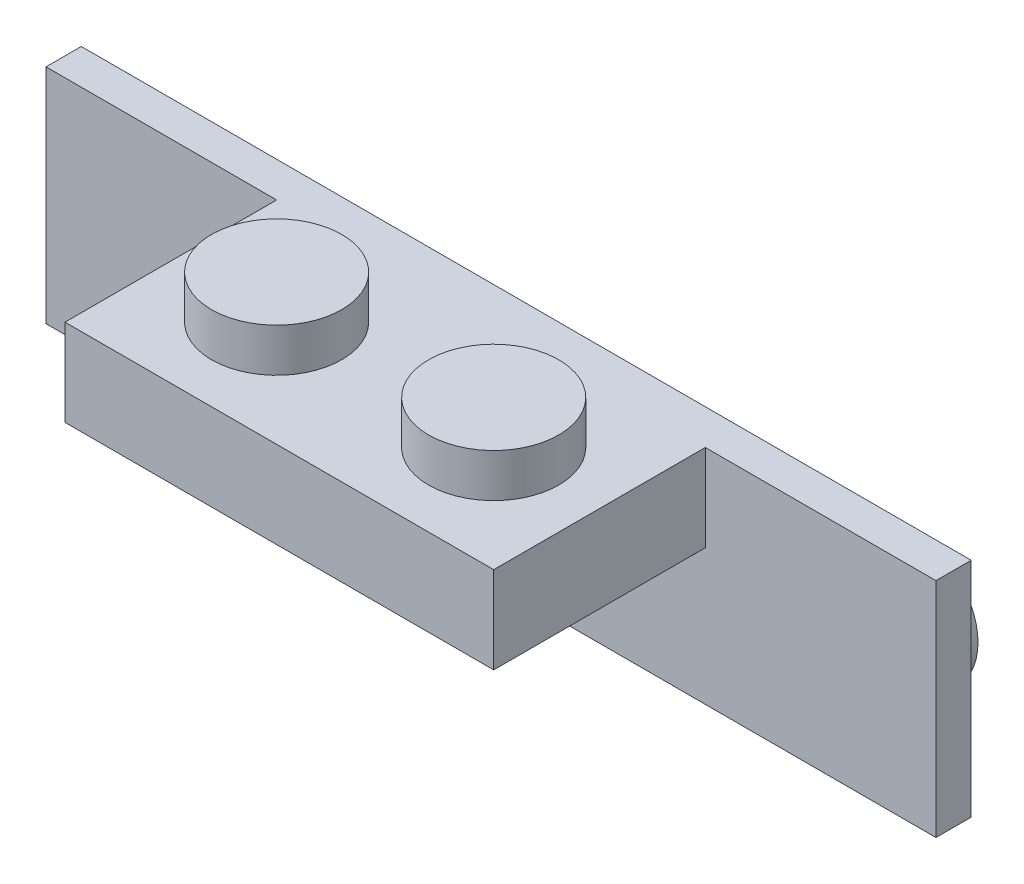
ISO-10303-21;
HEADER;
FILE_DESCRIPTION(('STEP AP214'),'2;1');
FILE_NAME('part.step','',(''),(''),'','','');
FILE_SCHEMA(('AUTOMOTIVE_DESIGN { 1 0 10303 214 1 1 1 1 }'));
ENDSEC;
DATA;
#1=APPLICATION_CONTEXT('core data for automotive mechanical design processes');
#2=APPLICATION_PROTOCOL_DEFINITION('international standard','automotive_design',2000,#1);
#3=PRODUCT_CONTEXT('',#1,'mechanical');
#4=PRODUCT('Part','Part','',(#3));
#5=PRODUCT_RELATED_PRODUCT_CATEGORY('part','',(#4));
#6=PRODUCT_DEFINITION_FORMATION('','',#4);
#7=PRODUCT_DEFINITION_CONTEXT('part definition',#1,'design');
#8=PRODUCT_DEFINITION('design','',#6,#7);
#9=PRODUCT_DEFINITION_SHAPE('','',#8);
#10=(LENGTH_UNIT() NAMED_UNIT(*) SI_UNIT(.MILLI.,.METRE.));
#11=(NAMED_UNIT(*) PLANE_ANGLE_UNIT() SI_UNIT($,.RADIAN.));
#12=(NAMED_UNIT(*) SI_UNIT($,.STERADIAN.) SOLID_ANGLE_UNIT());
#13=UNCERTAINTY_MEASURE_WITH_UNIT(LENGTH_MEASURE(1.E-05),#10,'distance_accuracy_value','');
#14=(GEOMETRIC_REPRESENTATION_CONTEXT(3) GLOBAL_UNCERTAINTY_ASSIGNED_CONTEXT((#13)) GLOBAL_UNIT_ASSIGNED_CONTEXT((#10,
#11,#12)) REPRESENTATION_CONTEXT('',''));
#15=CARTESIAN_POINT('',(0.,0.,0.));
#16=DIRECTION('',(0.,0.,1.));
#17=DIRECTION('',(1.,0.,0.));
#18=AXIS2_PLACEMENT_3D('',#15,#16,#17);
#19=CARTESIAN_POINT('',(0.,0.,-7.8));
#20=DIRECTION('',(0.,-1.,0.));
#21=DIRECTION('',(0.,0.,-1.));
#22=AXIS2_PLACEMENT_3D('',#19,#20,#21);
#23=PLANE('',#22);
#24=DIRECTION('',(1.,0.,0.));
#25=VECTOR('',#24,1.);
#26=CARTESIAN_POINT('',(0.,0.,0.));
#27=LINE('',#26,#25);
#28=CARTESIAN_POINT('',(0.,0.,0.));
#29=VERTEX_POINT('',#28);
#30=CARTESIAN_POINT('',(15.8,0.,0.));
#31=VERTEX_POINT('',#30);
#32=EDGE_CURVE('E106',#29,#31,#27,.T.);
#33=ORIENTED_EDGE('',*,*,#32,.F.);
#34=DIRECTION('',(0.,0.,1.));
#35=VECTOR('',#34,1.);
#36=CARTESIAN_POINT('',(0.,0.,-7.8));
#37=LINE('',#36,#35);
#38=CARTESIAN_POINT('',(0.,0.,-7.8));
#39=VERTEX_POINT('',#38);
#40=EDGE_CURVE('E127',#39,#29,#37,.T.);
#41=ORIENTED_EDGE('',*,*,#40,.F.);
#42=DIRECTION('',(1.,0.,0.));
#43=VECTOR('',#42,1.);
#44=CARTESIAN_POINT('',(0.,0.,-7.8));
#45=LINE('',#44,#43);
#46=CARTESIAN_POINT('',(15.8,0.,-7.8));
#47=VERTEX_POINT('',#46);
#48=EDGE_CURVE('E118',#39,#47,#45,.T.);
#49=ORIENTED_EDGE('',*,*,#48,.T.);
#50=DIRECTION('',(0.,0.,1.));
#51=VECTOR('',#50,1.);
#52=CARTESIAN_POINT('',(15.8,0.,-7.8));
#53=LINE('',#52,#51);
#54=EDGE_CURVE('E98',#47,#31,#53,.T.);
#55=ORIENTED_EDGE('',*,*,#54,.T.);
#56=EDGE_LOOP('',(#33,#41,#49,#55));
#57=FACE_BOUND('',#56,.T.);
#58=DIRECTION('',(0.,0.,1.));
#59=VECTOR('',#58,1.);
#60=CARTESIAN_POINT('',(1.2,0.,-7.8));
#61=LINE('',#60,#59);
#62=CARTESIAN_POINT('',(1.2,0.,-6.6));
#63=VERTEX_POINT('',#62);
#64=CARTESIAN_POINT('',(1.2,0.,-1.2));
#65=VERTEX_POINT('',#64);
#66=EDGE_CURVE('E249',#63,#65,#61,.T.);
#67=ORIENTED_EDGE('',*,*,#66,.T.);
#68=DIRECTION('',(1.,0.,0.));
#69=VECTOR('',#68,1.);
#70=CARTESIAN_POINT('',(0.,0.,-1.2));
#71=LINE('',#70,#69);
#72=CARTESIAN_POINT('',(14.6,0.,-1.2));
#73=VERTEX_POINT('',#72);
#74=EDGE_CURVE('E217',#65,#73,#71,.T.);
#75=ORIENTED_EDGE('',*,*,#74,.T.);
#76=DIRECTION('',(0.,0.,1.));
#77=VECTOR('',#76,1.);
#78=CARTESIAN_POINT('',(14.6,0.,-7.8));
#79=LINE('',#78,#77);
#80=CARTESIAN_POINT('',(14.6,0.,-6.6));
#81=VERTEX_POINT('',#80);
#82=EDGE_CURVE('E244',#81,#73,#79,.T.);
#83=ORIENTED_EDGE('',*,*,#82,.F.);
#84=DIRECTION('',(1.,0.,0.));
#85=VECTOR('',#84,1.);
#86=CARTESIAN_POINT('',(0.,0.,-6.6));
#87=LINE('',#86,#85);
#88=EDGE_CURVE('E59',#63,#81,#87,.T.);
#89=ORIENTED_EDGE('',*,*,#88,.F.);
#90=EDGE_LOOP('',(#67,#75,#83,#89));
#91=FACE_BOUND('',#90,.T.);
#92=ADVANCED_FACE('F43',(#57,#91),#23,.T.);
#93=CARTESIAN_POINT('',(0.,0.,-7.8));
#94=DIRECTION('',(-1.,0.,0.));
#95=DIRECTION('',(0.,0.,1.));
#96=AXIS2_PLACEMENT_3D('',#93,#94,#95);
#97=PLANE('',#96);
#98=DIRECTION('',(0.,-1.,0.));
#99=VECTOR('',#98,1.);
#100=CARTESIAN_POINT('',(0.,0.,0.));
#101=LINE('',#100,#99);
#102=CARTESIAN_POINT('',(0.,3.2,0.));
#103=VERTEX_POINT('',#102);
#104=EDGE_CURVE('E285',#103,#29,#101,.T.);
#105=ORIENTED_EDGE('',*,*,#104,.F.);
#106=DIRECTION('',(0.,0.,1.));
#107=VECTOR('',#106,1.);
#108=CARTESIAN_POINT('',(0.,3.2,-7.8));
#109=LINE('',#108,#107);
#110=CARTESIAN_POINT('',(0.,3.2,-7.8));
#111=VERTEX_POINT('',#110);
#112=EDGE_CURVE('E97',#111,#103,#109,.T.);
#113=ORIENTED_EDGE('',*,*,#112,.F.);
#114=DIRECTION('',(0.,-1.,0.));
#115=VECTOR('',#114,1.);
#116=CARTESIAN_POINT('',(0.,0.,-7.8));
#117=LINE('',#116,#115);
#118=EDGE_CURVE('E114',#111,#39,#117,.T.);
#119=ORIENTED_EDGE('',*,*,#118,.T.);
#120=ORIENTED_EDGE('',*,*,#40,.T.);
#121=EDGE_LOOP('',(#105,#113,#119,#120));
#122=FACE_BOUND('',#121,.T.);
#123=ADVANCED_FACE('F45',(#122),#97,.T.);
#124=CARTESIAN_POINT('',(0.,3.2,-7.8));
#125=DIRECTION('',(0.,1.,0.));
#126=DIRECTION('',(0.,0.,1.));
#127=AXIS2_PLACEMENT_3D('',#124,#125,#126);
#128=PLANE('',#127);
#129=CARTESIAN_POINT('',(11.9,3.2,-3.9));
#130=DIRECTION('',(0.,1.,0.));
#131=DIRECTION('',(0.,0.,1.));
#132=AXIS2_PLACEMENT_3D('',#129,#130,#131);
#133=CIRCLE('',#132,2.4);
#134=CARTESIAN_POINT('',(11.9,3.2,-1.5));
#135=VERTEX_POINT('',#134);
#136=EDGE_CURVE('E223',#135,#135,#133,.T.);
#137=ORIENTED_EDGE('',*,*,#136,.F.);
#138=EDGE_LOOP('',(#137));
#139=FACE_BOUND('',#138,.T.);
#140=CARTESIAN_POINT('',(3.9,3.2,-3.9));
#141=DIRECTION('',(0.,1.,0.));
#142=DIRECTION('',(0.,0.,1.));
#143=AXIS2_PLACEMENT_3D('',#140,#141,#142);
#144=CIRCLE('',#143,2.4);
#145=CARTESIAN_POINT('',(3.9,3.2,-1.5));
#146=VERTEX_POINT('',#145);
#147=EDGE_CURVE('E280',#146,#146,#144,.T.);
#148=ORIENTED_EDGE('',*,*,#147,.F.);
#149=EDGE_LOOP('',(#148));
#150=FACE_BOUND('',#149,.T.);
#151=DIRECTION('',(-1.,0.,0.));
#152=VECTOR('',#151,1.);
#153=CARTESIAN_POINT('',(0.,3.2,0.));
#154=LINE('',#153,#152);
#155=CARTESIAN_POINT('',(15.8,3.2,0.));
#156=VERTEX_POINT('',#155);
#157=EDGE_CURVE('E104',#156,#103,#154,.T.);
#158=ORIENTED_EDGE('',*,*,#157,.F.);
#159=DIRECTION('',(0.,0.,1.));
#160=VECTOR('',#159,1.);
#161=CARTESIAN_POINT('',(15.8,3.2,-7.8));
#162=LINE('',#161,#160);
#163=CARTESIAN_POINT('',(15.8,3.19999999999999,-7.8));
#164=VERTEX_POINT('',#163);
#165=EDGE_CURVE('E87',#164,#156,#162,.T.);
#166=ORIENTED_EDGE('',*,*,#165,.F.);
#167=DIRECTION('',(1.,0.,0.));
#168=VECTOR('',#167,1.);
#169=CARTESIAN_POINT('',(24.3,3.19999999999999,-7.8));
#170=LINE('',#169,#168);
#171=CARTESIAN_POINT('',(24.3,3.19999999999999,-7.8));
#172=VERTEX_POINT('',#171);
#173=EDGE_CURVE('E805',#164,#172,#170,.T.);
#174=ORIENTED_EDGE('',*,*,#173,.T.);
#175=DIRECTION('',(0.,0.,1.));
#176=VECTOR('',#175,1.);
#177=CARTESIAN_POINT('',(24.3,3.19999999999999,-9.1));
#178=LINE('',#177,#176);
#179=CARTESIAN_POINT('',(24.3,3.19999999999999,-9.1));
#180=VERTEX_POINT('',#179);
#181=EDGE_CURVE('E795',#180,#172,#178,.T.);
#182=ORIENTED_EDGE('',*,*,#181,.F.);
#183=DIRECTION('',(1.,0.,0.));
#184=VECTOR('',#183,1.);
#185=CARTESIAN_POINT('',(24.3,3.19999999999999,-9.1));
#186=LINE('',#185,#184);
#187=CARTESIAN_POINT('',(-8.5,3.2,-9.1));
#188=VERTEX_POINT('',#187);
#189=EDGE_CURVE('E173',#188,#180,#186,.T.);
#190=ORIENTED_EDGE('',*,*,#189,.F.);
#191=DIRECTION('',(0.,0.,1.));
#192=VECTOR('',#191,1.);
#193=CARTESIAN_POINT('',(-8.5,3.2,-9.1));
#194=LINE('',#193,#192);
#195=CARTESIAN_POINT('',(-8.5,3.2,-7.8));
#196=VERTEX_POINT('',#195);
#197=EDGE_CURVE('E201',#188,#196,#194,.T.);
#198=ORIENTED_EDGE('',*,*,#197,.T.);
#199=EDGE_CURVE('E180',#196,#111,#170,.T.);
#200=ORIENTED_EDGE('',*,*,#199,.T.);
#201=ORIENTED_EDGE('',*,*,#112,.T.);
#202=EDGE_LOOP('',(#158,#166,#174,#182,#190,#198,#200,#201));
#203=FACE_BOUND('',#202,.T.);
#204=ADVANCED_FACE('F109',(#139,#150,#203),#128,.T.);
#205=CARTESIAN_POINT('',(15.8,0.,-7.8));
#206=DIRECTION('',(1.,0.,0.));
#207=DIRECTION('',(0.,0.,-1.));
#208=AXIS2_PLACEMENT_3D('',#205,#206,#207);
#209=PLANE('',#208);
#210=DIRECTION('',(0.,1.,0.));
#211=VECTOR('',#210,1.);
#212=CARTESIAN_POINT('',(15.8,0.,0.));
#213=LINE('',#212,#211);
#214=EDGE_CURVE('E90',#31,#156,#213,.T.);
#215=ORIENTED_EDGE('',*,*,#214,.F.);
#216=ORIENTED_EDGE('',*,*,#54,.F.);
#217=DIRECTION('',(0.,1.,0.));
#218=VECTOR('',#217,1.);
#219=CARTESIAN_POINT('',(15.8,0.,-7.8));
#220=LINE('',#219,#218);
#221=EDGE_CURVE('E68',#47,#164,#220,.T.);
#222=ORIENTED_EDGE('',*,*,#221,.T.);
#223=ORIENTED_EDGE('',*,*,#165,.T.);
#224=EDGE_LOOP('',(#215,#216,#222,#223));
#225=FACE_BOUND('',#224,.T.);
#226=ADVANCED_FACE('F89',(#225),#209,.T.);
#227=CARTESIAN_POINT('',(0.,0.,0.));
#228=DIRECTION('',(0.,0.,-1.));
#229=DIRECTION('',(-1.,0.,0.));
#230=AXIS2_PLACEMENT_3D('',#227,#228,#229);
#231=PLANE('',#230);
#232=ORIENTED_EDGE('',*,*,#104,.T.);
#233=ORIENTED_EDGE('',*,*,#32,.T.);
#234=ORIENTED_EDGE('',*,*,#214,.T.);
#235=ORIENTED_EDGE('',*,*,#157,.T.);
#236=EDGE_LOOP('',(#232,#233,#234,#235));
#237=FACE_BOUND('',#236,.T.);
#238=ADVANCED_FACE('F103',(#237),#231,.F.);
#239=CARTESIAN_POINT('',(3.9,4.8,-3.9));
#240=DIRECTION('',(0.,-1.,0.));
#241=DIRECTION('',(0.,0.,-1.));
#242=AXIS2_PLACEMENT_3D('',#239,#240,#241);
#243=CYLINDRICAL_SURFACE('',#242,2.4);
#244=CARTESIAN_POINT('',(3.9,4.8,-3.9));
#245=DIRECTION('',(0.,1.,0.));
#246=DIRECTION('',(0.,0.,1.));
#247=AXIS2_PLACEMENT_3D('',#244,#245,#246);
#248=CIRCLE('',#247,2.4);
#249=CARTESIAN_POINT('',(3.9,4.8,-1.5));
#250=VERTEX_POINT('',#249);
#251=EDGE_CURVE('E281',#250,#250,#248,.T.);
#252=ORIENTED_EDGE('',*,*,#251,.F.);
#253=EDGE_LOOP('',(#252));
#254=FACE_BOUND('',#253,.T.);
#255=ORIENTED_EDGE('',*,*,#147,.T.);
#256=EDGE_LOOP('',(#255));
#257=FACE_BOUND('',#256,.T.);
#258=ADVANCED_FACE('F366',(#254,#257),#243,.T.);
#259=CARTESIAN_POINT('',(3.9,4.8,-3.9));
#260=DIRECTION('',(0.,1.,0.));
#261=DIRECTION('',(0.,0.,1.));
#262=AXIS2_PLACEMENT_3D('',#259,#260,#261);
#263=PLANE('',#262);
#264=ORIENTED_EDGE('',*,*,#251,.T.);
#265=EDGE_LOOP('',(#264));
#266=FACE_BOUND('',#265,.T.);
#267=ADVANCED_FACE('F369',(#266),#263,.T.);
#268=CARTESIAN_POINT('',(11.9,4.8,-3.9));
#269=DIRECTION('',(0.,-1.,0.));
#270=DIRECTION('',(0.,0.,-1.));
#271=AXIS2_PLACEMENT_3D('',#268,#269,#270);
#272=CYLINDRICAL_SURFACE('',#271,2.4);
#273=CARTESIAN_POINT('',(11.9,4.8,-3.9));
#274=DIRECTION('',(0.,1.,0.));
#275=DIRECTION('',(0.,0.,1.));
#276=AXIS2_PLACEMENT_3D('',#273,#274,#275);
#277=CIRCLE('',#276,2.4);
#278=CARTESIAN_POINT('',(11.9,4.8,-1.5));
#279=VERTEX_POINT('',#278);
#280=EDGE_CURVE('E276',#279,#279,#277,.T.);
#281=ORIENTED_EDGE('',*,*,#280,.F.);
#282=EDGE_LOOP('',(#281));
#283=FACE_BOUND('',#282,.T.);
#284=ORIENTED_EDGE('',*,*,#136,.T.);
#285=EDGE_LOOP('',(#284));
#286=FACE_BOUND('',#285,.T.);
#287=ADVANCED_FACE('F373',(#283,#286),#272,.T.);
#288=CARTESIAN_POINT('',(11.9,4.8,-3.9));
#289=DIRECTION('',(0.,1.,0.));
#290=DIRECTION('',(0.,0.,1.));
#291=AXIS2_PLACEMENT_3D('',#288,#289,#290);
#292=PLANE('',#291);
#293=ORIENTED_EDGE('',*,*,#280,.T.);
#294=EDGE_LOOP('',(#293));
#295=FACE_BOUND('',#294,.T.);
#296=ADVANCED_FACE('F346',(#295),#292,.T.);
#297=CARTESIAN_POINT('',(1.2,0.,-7.8));
#298=DIRECTION('',(-1.,0.,0.));
#299=DIRECTION('',(0.,0.,1.));
#300=AXIS2_PLACEMENT_3D('',#297,#298,#299);
#301=PLANE('',#300);
#302=DIRECTION('',(0.,-1.,0.));
#303=VECTOR('',#302,1.);
#304=CARTESIAN_POINT('',(1.2,0.,-1.2));
#305=LINE('',#304,#303);
#306=CARTESIAN_POINT('',(1.2,2.,-1.2));
#307=VERTEX_POINT('',#306);
#308=EDGE_CURVE('E213',#307,#65,#305,.T.);
#309=ORIENTED_EDGE('',*,*,#308,.T.);
#310=ORIENTED_EDGE('',*,*,#66,.F.);
#311=DIRECTION('',(0.,-1.,0.));
#312=VECTOR('',#311,1.);
#313=CARTESIAN_POINT('',(1.2,0.,-6.6));
#314=LINE('',#313,#312);
#315=CARTESIAN_POINT('',(1.2,2.,-6.6));
#316=VERTEX_POINT('',#315);
#317=EDGE_CURVE('E225',#316,#63,#314,.T.);
#318=ORIENTED_EDGE('',*,*,#317,.F.);
#319=DIRECTION('',(0.,0.,1.));
#320=VECTOR('',#319,1.);
#321=CARTESIAN_POINT('',(1.2,2.,-7.8));
#322=LINE('',#321,#320);
#323=EDGE_CURVE('E219',#316,#307,#322,.T.);
#324=ORIENTED_EDGE('',*,*,#323,.T.);
#325=EDGE_LOOP('',(#309,#310,#318,#324));
#326=FACE_BOUND('',#325,.T.);
#327=ADVANCED_FACE('F332',(#326),#301,.F.);
#328=CARTESIAN_POINT('',(0.,2.,-7.8));
#329=DIRECTION('',(0.,1.,0.));
#330=DIRECTION('',(0.,0.,1.));
#331=AXIS2_PLACEMENT_3D('',#328,#329,#330);
#332=PLANE('',#331);
#333=CARTESIAN_POINT('',(7.9,2.,-3.9));
#334=DIRECTION('',(0.,1.,0.));
#335=DIRECTION('',(0.,0.,1.));
#336=AXIS2_PLACEMENT_3D('',#333,#334,#335);
#337=CIRCLE('',#336,1.5);
#338=CARTESIAN_POINT('',(7.9,2.,-2.4));
#339=VERTEX_POINT('',#338);
#340=EDGE_CURVE('E123',#339,#339,#337,.F.);
#341=ORIENTED_EDGE('',*,*,#340,.F.);
#342=EDGE_LOOP('',(#341));
#343=FACE_BOUND('',#342,.T.);
#344=CARTESIAN_POINT('',(11.9,2.,-3.9));
#345=DIRECTION('',(0.,1.,0.));
#346=DIRECTION('',(0.,0.,1.));
#347=AXIS2_PLACEMENT_3D('',#344,#345,#346);
#348=CIRCLE('',#347,1.2);
#349=CARTESIAN_POINT('',(11.9,2.,-2.7));
#350=VERTEX_POINT('',#349);
#351=EDGE_CURVE('E209',#350,#350,#348,.T.);
#352=ORIENTED_EDGE('',*,*,#351,.T.);
#353=EDGE_LOOP('',(#352));
#354=FACE_BOUND('',#353,.T.);
#355=CARTESIAN_POINT('',(3.9,2.,-3.9));
#356=DIRECTION('',(0.,1.,0.));
#357=DIRECTION('',(0.,0.,1.));
#358=AXIS2_PLACEMENT_3D('',#355,#356,#357);
#359=CIRCLE('',#358,1.2);
#360=CARTESIAN_POINT('',(3.9,2.,-2.7));
#361=VERTEX_POINT('',#360);
#362=EDGE_CURVE('E233',#361,#361,#359,.T.);
#363=ORIENTED_EDGE('',*,*,#362,.T.);
#364=EDGE_LOOP('',(#363));
#365=FACE_BOUND('',#364,.T.);
#366=DIRECTION('',(-1.,0.,0.));
#367=VECTOR('',#366,1.);
#368=CARTESIAN_POINT('',(0.,2.,-1.2));
#369=LINE('',#368,#367);
#370=CARTESIAN_POINT('',(14.6,2.,-1.2));
#371=VERTEX_POINT('',#370);
#372=EDGE_CURVE('E228',#371,#307,#369,.T.);
#373=ORIENTED_EDGE('',*,*,#372,.T.);
#374=ORIENTED_EDGE('',*,*,#323,.F.);
#375=DIRECTION('',(-1.,0.,0.));
#376=VECTOR('',#375,1.);
#377=CARTESIAN_POINT('',(0.,2.,-6.6));
#378=LINE('',#377,#376);
#379=CARTESIAN_POINT('',(14.6,2.,-6.6));
#380=VERTEX_POINT('',#379);
#381=EDGE_CURVE('E245',#380,#316,#378,.T.);
#382=ORIENTED_EDGE('',*,*,#381,.F.);
#383=DIRECTION('',(0.,0.,1.));
#384=VECTOR('',#383,1.);
#385=CARTESIAN_POINT('',(14.6,2.,-7.8));
#386=LINE('',#385,#384);
#387=EDGE_CURVE('E224',#380,#371,#386,.T.);
#388=ORIENTED_EDGE('',*,*,#387,.T.);
#389=EDGE_LOOP('',(#373,#374,#382,#388));
#390=FACE_BOUND('',#389,.T.);
#391=ADVANCED_FACE('F336',(#343,#354,#365,#390),#332,.F.);
#392=CARTESIAN_POINT('',(14.6,0.,-7.8));
#393=DIRECTION('',(1.,0.,0.));
#394=DIRECTION('',(0.,0.,-1.));
#395=AXIS2_PLACEMENT_3D('',#392,#393,#394);
#396=PLANE('',#395);
#397=DIRECTION('',(0.,1.,0.));
#398=VECTOR('',#397,1.);
#399=CARTESIAN_POINT('',(14.6,0.,-1.2));
#400=LINE('',#399,#398);
#401=EDGE_CURVE('E240',#73,#371,#400,.T.);
#402=ORIENTED_EDGE('',*,*,#401,.T.);
#403=ORIENTED_EDGE('',*,*,#387,.F.);
#404=DIRECTION('',(0.,1.,0.));
#405=VECTOR('',#404,1.);
#406=CARTESIAN_POINT('',(14.6,0.,-6.6));
#407=LINE('',#406,#405);
#408=EDGE_CURVE('E250',#81,#380,#407,.T.);
#409=ORIENTED_EDGE('',*,*,#408,.F.);
#410=ORIENTED_EDGE('',*,*,#82,.T.);
#411=EDGE_LOOP('',(#402,#403,#409,#410));
#412=FACE_BOUND('',#411,.T.);
#413=ADVANCED_FACE('F325',(#412),#396,.F.);
#414=CARTESIAN_POINT('',(0.,0.,-6.6));
#415=DIRECTION('',(0.,0.,-1.));
#416=DIRECTION('',(-1.,0.,0.));
#417=AXIS2_PLACEMENT_3D('',#414,#415,#416);
#418=PLANE('',#417);
#419=ORIENTED_EDGE('',*,*,#317,.T.);
#420=ORIENTED_EDGE('',*,*,#88,.T.);
#421=ORIENTED_EDGE('',*,*,#408,.T.);
#422=ORIENTED_EDGE('',*,*,#381,.T.);
#423=EDGE_LOOP('',(#419,#420,#421,#422));
#424=FACE_BOUND('',#423,.T.);
#425=ADVANCED_FACE('F333',(#424),#418,.F.);
#426=CARTESIAN_POINT('',(0.,0.,-1.2));
#427=DIRECTION('',(0.,0.,-1.));
#428=DIRECTION('',(-1.,0.,0.));
#429=AXIS2_PLACEMENT_3D('',#426,#427,#428);
#430=PLANE('',#429);
#431=ORIENTED_EDGE('',*,*,#308,.F.);
#432=ORIENTED_EDGE('',*,*,#372,.F.);
#433=ORIENTED_EDGE('',*,*,#401,.F.);
#434=ORIENTED_EDGE('',*,*,#74,.F.);
#435=EDGE_LOOP('',(#431,#432,#433,#434));
#436=FACE_BOUND('',#435,.T.);
#437=ADVANCED_FACE('F329',(#436),#430,.T.);
#438=CARTESIAN_POINT('',(3.9,4.8,-3.9));
#439=DIRECTION('',(0.,-1.,0.));
#440=DIRECTION('',(0.,0.,-1.));
#441=AXIS2_PLACEMENT_3D('',#438,#439,#440);
#442=CYLINDRICAL_SURFACE('',#441,1.2);
#443=CARTESIAN_POINT('',(3.9,3.6,-3.9));
#444=DIRECTION('',(0.,1.,0.));
#445=DIRECTION('',(0.,0.,1.));
#446=AXIS2_PLACEMENT_3D('',#443,#444,#445);
#447=CIRCLE('',#446,1.2);
#448=CARTESIAN_POINT('',(3.9,3.6,-2.7));
#449=VERTEX_POINT('',#448);
#450=EDGE_CURVE('E218',#449,#449,#447,.T.);
#451=ORIENTED_EDGE('',*,*,#450,.T.);
#452=EDGE_LOOP('',(#451));
#453=FACE_BOUND('',#452,.T.);
#454=ORIENTED_EDGE('',*,*,#362,.F.);
#455=EDGE_LOOP('',(#454));
#456=FACE_BOUND('',#455,.T.);
#457=ADVANCED_FACE('F393',(#453,#456),#442,.F.);
#458=CARTESIAN_POINT('',(3.9,3.6,-3.9));
#459=DIRECTION('',(0.,1.,0.));
#460=DIRECTION('',(0.,0.,1.));
#461=AXIS2_PLACEMENT_3D('',#458,#459,#460);
#462=PLANE('',#461);
#463=ORIENTED_EDGE('',*,*,#450,.F.);
#464=EDGE_LOOP('',(#463));
#465=FACE_BOUND('',#464,.T.);
#466=ADVANCED_FACE('F389',(#465),#462,.F.);
#467=CARTESIAN_POINT('',(11.9,4.8,-3.9));
#468=DIRECTION('',(0.,-1.,0.));
#469=DIRECTION('',(0.,0.,-1.));
#470=AXIS2_PLACEMENT_3D('',#467,#468,#469);
#471=CYLINDRICAL_SURFACE('',#470,1.2);
#472=CARTESIAN_POINT('',(11.9,3.6,-3.9));
#473=DIRECTION('',(0.,1.,0.));
#474=DIRECTION('',(0.,0.,1.));
#475=AXIS2_PLACEMENT_3D('',#472,#473,#474);
#476=CIRCLE('',#475,1.2);
#477=CARTESIAN_POINT('',(11.9,3.6,-2.7));
#478=VERTEX_POINT('',#477);
#479=EDGE_CURVE('E232',#478,#478,#476,.T.);
#480=ORIENTED_EDGE('',*,*,#479,.T.);
#481=EDGE_LOOP('',(#480));
#482=FACE_BOUND('',#481,.T.);
#483=ORIENTED_EDGE('',*,*,#351,.F.);
#484=EDGE_LOOP('',(#483));
#485=FACE_BOUND('',#484,.T.);
#486=ADVANCED_FACE('F385',(#482,#485),#471,.F.);
#487=CARTESIAN_POINT('',(11.9,3.6,-3.9));
#488=DIRECTION('',(0.,1.,0.));
#489=DIRECTION('',(0.,0.,1.));
#490=AXIS2_PLACEMENT_3D('',#487,#488,#489);
#491=PLANE('',#490);
#492=ORIENTED_EDGE('',*,*,#479,.F.);
#493=EDGE_LOOP('',(#492));
#494=FACE_BOUND('',#493,.T.);
#495=ADVANCED_FACE('F381',(#494),#491,.F.);
#496=CARTESIAN_POINT('',(7.9,-4.24264068711929,-3.9));
#497=DIRECTION('',(0.,1.,0.));
#498=DIRECTION('',(0.,0.,1.));
#499=AXIS2_PLACEMENT_3D('',#496,#497,#498);
#500=CYLINDRICAL_SURFACE('',#499,1.5);
#501=ORIENTED_EDGE('',*,*,#340,.T.);
#502=EDGE_LOOP('',(#501));
#503=FACE_BOUND('',#502,.T.);
#504=CARTESIAN_POINT('',(7.9,0.2,-3.9));
#505=DIRECTION('',(0.,-1.,0.));
#506=DIRECTION('',(0.,0.,-1.));
#507=AXIS2_PLACEMENT_3D('',#504,#505,#506);
#508=CIRCLE('',#507,1.5);
#509=CARTESIAN_POINT('',(7.9,0.2,-5.4));
#510=VERTEX_POINT('',#509);
#511=EDGE_CURVE('E205',#510,#510,#508,.T.);
#512=ORIENTED_EDGE('',*,*,#511,.F.);
#513=EDGE_LOOP('',(#512));
#514=FACE_BOUND('',#513,.T.);
#515=ADVANCED_FACE('F384',(#503,#514),#500,.T.);
#516=CARTESIAN_POINT('',(7.9,-4.24264068711929,-3.9));
#517=DIRECTION('',(0.,1.,0.));
#518=DIRECTION('',(0.,0.,1.));
#519=AXIS2_PLACEMENT_3D('',#516,#517,#518);
#520=CYLINDRICAL_SURFACE('',#519,0.6);
#521=CARTESIAN_POINT('',(7.9,2.,-3.9));
#522=DIRECTION('',(0.,-1.,0.));
#523=DIRECTION('',(0.,0.,-1.));
#524=AXIS2_PLACEMENT_3D('',#521,#522,#523);
#525=CIRCLE('',#524,0.6);
#526=CARTESIAN_POINT('',(7.9,2.,-4.5));
#527=VERTEX_POINT('',#526);
#528=EDGE_CURVE('E198',#527,#527,#525,.T.);
#529=ORIENTED_EDGE('',*,*,#528,.F.);
#530=EDGE_LOOP('',(#529));
#531=FACE_BOUND('',#530,.T.);
#532=CARTESIAN_POINT('',(7.9,0.2,-3.9));
#533=DIRECTION('',(0.,-1.,0.));
#534=DIRECTION('',(0.,0.,-1.));
#535=AXIS2_PLACEMENT_3D('',#532,#533,#534);
#536=CIRCLE('',#535,0.6);
#537=CARTESIAN_POINT('',(7.9,0.2,-4.5));
#538=VERTEX_POINT('',#537);
#539=EDGE_CURVE('E192',#538,#538,#536,.T.);
#540=ORIENTED_EDGE('',*,*,#539,.T.);
#541=EDGE_LOOP('',(#540));
#542=FACE_BOUND('',#541,.T.);
#543=ADVANCED_FACE('F431',(#531,#542),#520,.F.);
#544=CARTESIAN_POINT('',(0.,0.2,-7.8));
#545=DIRECTION('',(0.,-1.,0.));
#546=DIRECTION('',(0.,0.,-1.));
#547=AXIS2_PLACEMENT_3D('',#544,#545,#546);
#548=PLANE('',#547);
#549=ORIENTED_EDGE('',*,*,#539,.F.);
#550=EDGE_LOOP('',(#549));
#551=FACE_BOUND('',#550,.T.);
#552=ORIENTED_EDGE('',*,*,#511,.T.);
#553=EDGE_LOOP('',(#552));
#554=FACE_BOUND('',#553,.T.);
#555=ADVANCED_FACE('F351',(#551,#554),#548,.T.);
#556=ORIENTED_EDGE('',*,*,#528,.T.);
#557=EDGE_LOOP('',(#556));
#558=FACE_BOUND('',#557,.T.);
#559=ADVANCED_FACE('F340',(#558),#332,.F.);
#560=CARTESIAN_POINT('',(0.,0.,-7.8));
#561=DIRECTION('',(0.,0.,1.));
#562=DIRECTION('',(1.,0.,0.));
#563=AXIS2_PLACEMENT_3D('',#560,#561,#562);
#564=PLANE('',#563);
#565=ORIENTED_EDGE('',*,*,#118,.F.);
#566=ORIENTED_EDGE('',*,*,#199,.F.);
#567=DIRECTION('',(0.,1.,0.));
#568=VECTOR('',#567,1.);
#569=CARTESIAN_POINT('',(-8.5,3.2,-7.8));
#570=LINE('',#569,#568);
#571=CARTESIAN_POINT('',(-8.5,-5.,-7.8));
#572=VERTEX_POINT('',#571);
#573=EDGE_CURVE('E801',#572,#196,#570,.T.);
#574=ORIENTED_EDGE('',*,*,#573,.F.);
#575=DIRECTION('',(-1.,0.,0.));
#576=VECTOR('',#575,1.);
#577=CARTESIAN_POINT('',(-8.5,-5.,-7.8));
#578=LINE('',#577,#576);
#579=CARTESIAN_POINT('',(24.3,-5.,-7.8));
#580=VERTEX_POINT('',#579);
#581=EDGE_CURVE('E798',#580,#572,#578,.T.);
#582=ORIENTED_EDGE('',*,*,#581,.F.);
#583=DIRECTION('',(0.,-1.,0.));
#584=VECTOR('',#583,1.);
#585=CARTESIAN_POINT('',(24.3,-5.,-7.8));
#586=LINE('',#585,#584);
#587=EDGE_CURVE('E188',#172,#580,#586,.T.);
#588=ORIENTED_EDGE('',*,*,#587,.F.);
#589=ORIENTED_EDGE('',*,*,#173,.F.);
#590=ORIENTED_EDGE('',*,*,#221,.F.);
#591=ORIENTED_EDGE('',*,*,#48,.F.);
#592=EDGE_LOOP('',(#565,#566,#574,#582,#588,#589,#590,#591));
#593=FACE_BOUND('',#592,.T.);
#594=ADVANCED_FACE('F303',(#593),#564,.T.);
#595=CARTESIAN_POINT('',(24.3,-5.,-9.1));
#596=DIRECTION('',(-1.,0.,0.));
#597=DIRECTION('',(0.,0.,1.));
#598=AXIS2_PLACEMENT_3D('',#595,#596,#597);
#599=PLANE('',#598);
#600=ORIENTED_EDGE('',*,*,#587,.T.);
#601=DIRECTION('',(0.,0.,1.));
#602=VECTOR('',#601,1.);
#603=CARTESIAN_POINT('',(24.3,-5.,-9.1));
#604=LINE('',#603,#602);
#605=CARTESIAN_POINT('',(24.3,-5.,-9.1));
#606=VERTEX_POINT('',#605);
#607=EDGE_CURVE('E184',#606,#580,#604,.T.);
#608=ORIENTED_EDGE('',*,*,#607,.F.);
#609=DIRECTION('',(0.,-1.,0.));
#610=VECTOR('',#609,1.);
#611=CARTESIAN_POINT('',(24.3,-5.,-9.1));
#612=LINE('',#611,#610);
#613=EDGE_CURVE('E164',#180,#606,#612,.T.);
#614=ORIENTED_EDGE('',*,*,#613,.F.);
#615=ORIENTED_EDGE('',*,*,#181,.T.);
#616=EDGE_LOOP('',(#600,#608,#614,#615));
#617=FACE_BOUND('',#616,.T.);
#618=ADVANCED_FACE('F185',(#617),#599,.F.);
#619=CARTESIAN_POINT('',(-8.5,-5.,-9.1));
#620=DIRECTION('',(0.,1.,0.));
#621=DIRECTION('',(-1.,0.,0.));
#622=AXIS2_PLACEMENT_3D('',#619,#620,#621);
#623=PLANE('',#622);
#624=ORIENTED_EDGE('',*,*,#581,.T.);
#625=DIRECTION('',(0.,0.,1.));
#626=VECTOR('',#625,1.);
#627=CARTESIAN_POINT('',(-8.5,-5.,-9.1));
#628=LINE('',#627,#626);
#629=CARTESIAN_POINT('',(-8.5,-5.,-9.1));
#630=VERTEX_POINT('',#629);
#631=EDGE_CURVE('E193',#630,#572,#628,.T.);
#632=ORIENTED_EDGE('',*,*,#631,.F.);
#633=DIRECTION('',(-1.,0.,0.));
#634=VECTOR('',#633,1.);
#635=CARTESIAN_POINT('',(-8.5,-5.,-9.1));
#636=LINE('',#635,#634);
#637=EDGE_CURVE('E169',#606,#630,#636,.T.);
#638=ORIENTED_EDGE('',*,*,#637,.F.);
#639=ORIENTED_EDGE('',*,*,#607,.T.);
#640=EDGE_LOOP('',(#624,#632,#638,#639));
#641=FACE_BOUND('',#640,.T.);
#642=ADVANCED_FACE('F466',(#641),#623,.F.);
#643=CARTESIAN_POINT('',(-8.5,3.2,-9.1));
#644=DIRECTION('',(1.,0.,0.));
#645=DIRECTION('',(0.,0.,-1.));
#646=AXIS2_PLACEMENT_3D('',#643,#644,#645);
#647=PLANE('',#646);
#648=ORIENTED_EDGE('',*,*,#573,.T.);
#649=ORIENTED_EDGE('',*,*,#197,.F.);
#650=DIRECTION('',(0.,1.,0.));
#651=VECTOR('',#650,1.);
#652=CARTESIAN_POINT('',(-8.5,3.2,-9.1));
#653=LINE('',#652,#651);
#654=EDGE_CURVE('E790',#630,#188,#653,.T.);
#655=ORIENTED_EDGE('',*,*,#654,.F.);
#656=ORIENTED_EDGE('',*,*,#631,.T.);
#657=EDGE_LOOP('',(#648,#649,#655,#656));
#658=FACE_BOUND('',#657,.T.);
#659=ADVANCED_FACE('F150',(#658),#647,.F.);
#660=CARTESIAN_POINT('',(0.,0.,-9.1));
#661=DIRECTION('',(0.,0.,1.));
#662=DIRECTION('',(1.,0.,0.));
#663=AXIS2_PLACEMENT_3D('',#660,#661,#662);
#664=PLANE('',#663);
#665=CARTESIAN_POINT('',(-3.6,-1.1,-9.1));
#666=DIRECTION('',(0.,0.,1.));
#667=DIRECTION('',(1.,0.,0.));
#668=AXIS2_PLACEMENT_3D('',#665,#666,#667);
#669=CIRCLE('',#668,2.35);
#670=CARTESIAN_POINT('',(-1.25,-1.1,-9.1));
#671=VERTEX_POINT('',#670);
#672=EDGE_CURVE('E12',#671,#671,#669,.F.);
#673=ORIENTED_EDGE('',*,*,#672,.F.);
#674=EDGE_LOOP('',(#673));
#675=FACE_BOUND('',#674,.T.);
#676=CARTESIAN_POINT('',(4.4,-1.1,-9.1));
#677=DIRECTION('',(0.,0.,1.));
#678=DIRECTION('',(1.,0.,0.));
#679=AXIS2_PLACEMENT_3D('',#676,#677,#678);
#680=CIRCLE('',#679,2.35);
#681=CARTESIAN_POINT('',(6.75,-1.1,-9.1));
#682=VERTEX_POINT('',#681);
#683=EDGE_CURVE('E52',#682,#682,#680,.F.);
#684=ORIENTED_EDGE('',*,*,#683,.F.);
#685=EDGE_LOOP('',(#684));
#686=FACE_BOUND('',#685,.T.);
#687=CARTESIAN_POINT('',(12.4,-1.1,-9.1));
#688=DIRECTION('',(0.,0.,1.));
#689=DIRECTION('',(1.,0.,0.));
#690=AXIS2_PLACEMENT_3D('',#687,#688,#689);
#691=CIRCLE('',#690,2.35);
#692=CARTESIAN_POINT('',(14.75,-1.1,-9.1));
#693=VERTEX_POINT('',#692);
#694=EDGE_CURVE('E137',#693,#693,#691,.F.);
#695=ORIENTED_EDGE('',*,*,#694,.F.);
#696=EDGE_LOOP('',(#695));
#697=FACE_BOUND('',#696,.T.);
#698=CARTESIAN_POINT('',(20.4,-1.1,-9.1));
#699=DIRECTION('',(0.,0.,1.));
#700=DIRECTION('',(1.,0.,0.));
#701=AXIS2_PLACEMENT_3D('',#698,#699,#700);
#702=CIRCLE('',#701,2.35);
#703=CARTESIAN_POINT('',(22.75,-1.1,-9.1));
#704=VERTEX_POINT('',#703);
#705=EDGE_CURVE('E133',#704,#704,#702,.F.);
#706=ORIENTED_EDGE('',*,*,#705,.F.);
#707=EDGE_LOOP('',(#706));
#708=FACE_BOUND('',#707,.T.);
#709=ORIENTED_EDGE('',*,*,#613,.T.);
#710=ORIENTED_EDGE('',*,*,#637,.T.);
#711=ORIENTED_EDGE('',*,*,#654,.T.);
#712=ORIENTED_EDGE('',*,*,#189,.T.);
#713=EDGE_LOOP('',(#709,#710,#711,#712));
#714=FACE_BOUND('',#713,.T.);
#715=ADVANCED_FACE('F146',(#675,#686,#697,#708,#714),#664,.F.);
#716=CARTESIAN_POINT('',(20.4,-1.1,-10.9));
#717=DIRECTION('',(0.,0.,-1.));
#718=DIRECTION('',(-1.,0.,0.));
#719=AXIS2_PLACEMENT_3D('',#716,#717,#718);
#720=PLANE('',#719);
#721=CARTESIAN_POINT('',(20.4,-1.1,-10.9));
#722=DIRECTION('',(0.,0.,-1.));
#723=DIRECTION('',(-1.,0.,0.));
#724=AXIS2_PLACEMENT_3D('',#721,#722,#723);
#725=CIRCLE('',#724,2.35);
#726=CARTESIAN_POINT('',(18.05,-1.1,-10.9));
#727=VERTEX_POINT('',#726);
#728=EDGE_CURVE('E781',#727,#727,#725,.T.);
#729=ORIENTED_EDGE('',*,*,#728,.T.);
#730=EDGE_LOOP('',(#729));
#731=FACE_BOUND('',#730,.T.);
#732=CARTESIAN_POINT('',(20.4,-1.1,-10.9));
#733=DIRECTION('',(0.,0.,-1.));
#734=DIRECTION('',(-1.,0.,0.));
#735=AXIS2_PLACEMENT_3D('',#732,#733,#734);
#736=CIRCLE('',#735,1.55);
#737=CARTESIAN_POINT('',(18.85,-1.1,-10.9));
#738=VERTEX_POINT('',#737);
#739=EDGE_CURVE('E777',#738,#738,#736,.T.);
#740=ORIENTED_EDGE('',*,*,#739,.F.);
#741=EDGE_LOOP('',(#740));
#742=FACE_BOUND('',#741,.T.);
#743=ADVANCED_FACE('F149',(#731,#742),#720,.T.);
#744=CARTESIAN_POINT('',(20.4,-1.1,-10.9));
#745=DIRECTION('',(0.,0.,1.));
#746=DIRECTION('',(1.,0.,0.));
#747=AXIS2_PLACEMENT_3D('',#744,#745,#746);
#748=CYLINDRICAL_SURFACE('',#747,2.35);
#749=ORIENTED_EDGE('',*,*,#728,.F.);
#750=EDGE_LOOP('',(#749));
#751=FACE_BOUND('',#750,.T.);
#752=ORIENTED_EDGE('',*,*,#705,.T.);
#753=EDGE_LOOP('',(#752));
#754=FACE_BOUND('',#753,.T.);
#755=ADVANCED_FACE('F492',(#751,#754),#748,.T.);
#756=CARTESIAN_POINT('',(20.4,-1.1,-10.9));
#757=DIRECTION('',(0.,0.,1.));
#758=DIRECTION('',(1.,0.,0.));
#759=AXIS2_PLACEMENT_3D('',#756,#757,#758);
#760=CYLINDRICAL_SURFACE('',#759,1.55);
#761=ORIENTED_EDGE('',*,*,#739,.T.);
#762=EDGE_LOOP('',(#761));
#763=FACE_BOUND('',#762,.T.);
#764=CARTESIAN_POINT('',(20.4,-1.1,-9.1));
#765=DIRECTION('',(0.,0.,-1.));
#766=DIRECTION('',(-1.,0.,0.));
#767=AXIS2_PLACEMENT_3D('',#764,#765,#766);
#768=CIRCLE('',#767,1.55);
#769=CARTESIAN_POINT('',(18.85,-1.1,-9.1));
#770=VERTEX_POINT('',#769);
#771=EDGE_CURVE('E776',#770,#770,#768,.T.);
#772=ORIENTED_EDGE('',*,*,#771,.F.);
#773=EDGE_LOOP('',(#772));
#774=FACE_BOUND('',#773,.T.);
#775=ADVANCED_FACE('F500',(#763,#774),#760,.F.);
#776=ORIENTED_EDGE('',*,*,#771,.T.);
#777=EDGE_LOOP('',(#776));
#778=FACE_BOUND('',#777,.T.);
#779=ADVANCED_FACE('F154',(#778),#664,.F.);
#780=CARTESIAN_POINT('',(12.4,-1.1,-10.9));
#781=DIRECTION('',(0.,0.,-1.));
#782=DIRECTION('',(-1.,0.,0.));
#783=AXIS2_PLACEMENT_3D('',#780,#781,#782);
#784=PLANE('',#783);
#785=CARTESIAN_POINT('',(12.4,-1.1,-10.9));
#786=DIRECTION('',(0.,0.,-1.));
#787=DIRECTION('',(-1.,0.,0.));
#788=AXIS2_PLACEMENT_3D('',#785,#786,#787);
#789=CIRCLE('',#788,2.35);
#790=CARTESIAN_POINT('',(10.05,-1.1,-10.9));
#791=VERTEX_POINT('',#790);
#792=EDGE_CURVE('E769',#791,#791,#789,.T.);
#793=ORIENTED_EDGE('',*,*,#792,.T.);
#794=EDGE_LOOP('',(#793));
#795=FACE_BOUND('',#794,.T.);
#796=CARTESIAN_POINT('',(12.4,-1.1,-10.9));
#797=DIRECTION('',(0.,0.,-1.));
#798=DIRECTION('',(-1.,0.,0.));
#799=AXIS2_PLACEMENT_3D('',#796,#797,#798);
#800=CIRCLE('',#799,1.55);
#801=CARTESIAN_POINT('',(10.85,-1.1,-10.9));
#802=VERTEX_POINT('',#801);
#803=EDGE_CURVE('E765',#802,#802,#800,.T.);
#804=ORIENTED_EDGE('',*,*,#803,.F.);
#805=EDGE_LOOP('',(#804));
#806=FACE_BOUND('',#805,.T.);
#807=ADVANCED_FACE('F514',(#795,#806),#784,.T.);
#808=CARTESIAN_POINT('',(12.4,-1.1,-10.9));
#809=DIRECTION('',(0.,0.,1.));
#810=DIRECTION('',(1.,0.,0.));
#811=AXIS2_PLACEMENT_3D('',#808,#809,#810);
#812=CYLINDRICAL_SURFACE('',#811,2.35);
#813=ORIENTED_EDGE('',*,*,#792,.F.);
#814=EDGE_LOOP('',(#813));
#815=FACE_BOUND('',#814,.T.);
#816=ORIENTED_EDGE('',*,*,#694,.T.);
#817=EDGE_LOOP('',(#816));
#818=FACE_BOUND('',#817,.T.);
#819=ADVANCED_FACE('F521',(#815,#818),#812,.T.);
#820=CARTESIAN_POINT('',(12.4,-1.1,-10.9));
#821=DIRECTION('',(0.,0.,1.));
#822=DIRECTION('',(1.,0.,0.));
#823=AXIS2_PLACEMENT_3D('',#820,#821,#822);
#824=CYLINDRICAL_SURFACE('',#823,1.55);
#825=ORIENTED_EDGE('',*,*,#803,.T.);
#826=EDGE_LOOP('',(#825));
#827=FACE_BOUND('',#826,.T.);
#828=CARTESIAN_POINT('',(12.4,-1.1,-9.1));
#829=DIRECTION('',(0.,0.,-1.));
#830=DIRECTION('',(-1.,0.,0.));
#831=AXIS2_PLACEMENT_3D('',#828,#829,#830);
#832=CIRCLE('',#831,1.55);
#833=CARTESIAN_POINT('',(10.85,-1.1,-9.1));
#834=VERTEX_POINT('',#833);
#835=EDGE_CURVE('E764',#834,#834,#832,.T.);
#836=ORIENTED_EDGE('',*,*,#835,.F.);
#837=EDGE_LOOP('',(#836));
#838=FACE_BOUND('',#837,.T.);
#839=ADVANCED_FACE('F529',(#827,#838),#824,.F.);
#840=ORIENTED_EDGE('',*,*,#835,.T.);
#841=EDGE_LOOP('',(#840));
#842=FACE_BOUND('',#841,.T.);
#843=ADVANCED_FACE('F516',(#842),#664,.F.);
#844=CARTESIAN_POINT('',(4.4,-1.1,-10.9));
#845=DIRECTION('',(0.,0.,-1.));
#846=DIRECTION('',(-1.,0.,0.));
#847=AXIS2_PLACEMENT_3D('',#844,#845,#846);
#848=PLANE('',#847);
#849=CARTESIAN_POINT('',(4.4,-1.1,-10.9));
#850=DIRECTION('',(0.,0.,-1.));
#851=DIRECTION('',(-1.,0.,0.));
#852=AXIS2_PLACEMENT_3D('',#849,#850,#851);
#853=CIRCLE('',#852,2.35);
#854=CARTESIAN_POINT('',(2.05,-1.1,-10.9));
#855=VERTEX_POINT('',#854);
#856=EDGE_CURVE('E757',#855,#855,#853,.T.);
#857=ORIENTED_EDGE('',*,*,#856,.T.);
#858=EDGE_LOOP('',(#857));
#859=FACE_BOUND('',#858,.T.);
#860=CARTESIAN_POINT('',(4.4,-1.1,-10.9));
#861=DIRECTION('',(0.,0.,-1.));
#862=DIRECTION('',(-1.,0.,0.));
#863=AXIS2_PLACEMENT_3D('',#860,#861,#862);
#864=CIRCLE('',#863,1.55);
#865=CARTESIAN_POINT('',(2.85,-1.1,-10.9));
#866=VERTEX_POINT('',#865);
#867=EDGE_CURVE('E753',#866,#866,#864,.T.);
#868=ORIENTED_EDGE('',*,*,#867,.F.);
#869=EDGE_LOOP('',(#868));
#870=FACE_BOUND('',#869,.T.);
#871=ADVANCED_FACE('F544',(#859,#870),#848,.T.);
#872=CARTESIAN_POINT('',(4.4,-1.1,-10.9));
#873=DIRECTION('',(0.,0.,1.));
#874=DIRECTION('',(1.,0.,0.));
#875=AXIS2_PLACEMENT_3D('',#872,#873,#874);
#876=CYLINDRICAL_SURFACE('',#875,2.35);
#877=ORIENTED_EDGE('',*,*,#856,.F.);
#878=EDGE_LOOP('',(#877));
#879=FACE_BOUND('',#878,.T.);
#880=ORIENTED_EDGE('',*,*,#683,.T.);
#881=EDGE_LOOP('',(#880));
#882=FACE_BOUND('',#881,.T.);
#883=ADVANCED_FACE('F144',(#879,#882),#876,.T.);
#884=CARTESIAN_POINT('',(4.4,-1.1,-10.9));
#885=DIRECTION('',(0.,0.,1.));
#886=DIRECTION('',(1.,0.,0.));
#887=AXIS2_PLACEMENT_3D('',#884,#885,#886);
#888=CYLINDRICAL_SURFACE('',#887,1.55);
#889=ORIENTED_EDGE('',*,*,#867,.T.);
#890=EDGE_LOOP('',(#889));
#891=FACE_BOUND('',#890,.T.);
#892=CARTESIAN_POINT('',(4.4,-1.1,-9.1));
#893=DIRECTION('',(0.,0.,-1.));
#894=DIRECTION('',(-1.,0.,0.));
#895=AXIS2_PLACEMENT_3D('',#892,#893,#894);
#896=CIRCLE('',#895,1.55);
#897=CARTESIAN_POINT('',(2.85,-1.1,-9.1));
#898=VERTEX_POINT('',#897);
#899=EDGE_CURVE('E752',#898,#898,#896,.T.);
#900=ORIENTED_EDGE('',*,*,#899,.F.);
#901=EDGE_LOOP('',(#900));
#902=FACE_BOUND('',#901,.T.);
#903=ADVANCED_FACE('F559',(#891,#902),#888,.F.);
#904=ORIENTED_EDGE('',*,*,#899,.T.);
#905=EDGE_LOOP('',(#904));
#906=FACE_BOUND('',#905,.T.);
#907=ADVANCED_FACE('F546',(#906),#664,.F.);
#908=CARTESIAN_POINT('',(-3.6,-1.1,-10.9));
#909=DIRECTION('',(0.,0.,-1.));
#910=DIRECTION('',(-1.,0.,0.));
#911=AXIS2_PLACEMENT_3D('',#908,#909,#910);
#912=PLANE('',#911);
#913=CARTESIAN_POINT('',(-3.6,-1.1,-10.9));
#914=DIRECTION('',(0.,0.,-1.));
#915=DIRECTION('',(-1.,0.,0.));
#916=AXIS2_PLACEMENT_3D('',#913,#914,#915);
#917=CIRCLE('',#916,2.35);
#918=CARTESIAN_POINT('',(-5.95,-1.1,-10.9));
#919=VERTEX_POINT('',#918);
#920=EDGE_CURVE('E746',#919,#919,#917,.T.);
#921=ORIENTED_EDGE('',*,*,#920,.T.);
#922=EDGE_LOOP('',(#921));
#923=FACE_BOUND('',#922,.T.);
#924=CARTESIAN_POINT('',(-3.6,-1.1,-10.9));
#925=DIRECTION('',(0.,0.,-1.));
#926=DIRECTION('',(-1.,0.,0.));
#927=AXIS2_PLACEMENT_3D('',#924,#925,#926);
#928=CIRCLE('',#927,1.55);
#929=CARTESIAN_POINT('',(-5.15,-1.1,-10.9));
#930=VERTEX_POINT('',#929);
#931=EDGE_CURVE('E742',#930,#930,#928,.T.);
#932=ORIENTED_EDGE('',*,*,#931,.F.);
#933=EDGE_LOOP('',(#932));
#934=FACE_BOUND('',#933,.T.);
#935=ADVANCED_FACE('F574',(#923,#934),#912,.T.);
#936=CARTESIAN_POINT('',(-3.6,-1.1,-10.9));
#937=DIRECTION('',(0.,0.,1.));
#938=DIRECTION('',(1.,0.,0.));
#939=AXIS2_PLACEMENT_3D('',#936,#937,#938);
#940=CYLINDRICAL_SURFACE('',#939,2.35);
#941=ORIENTED_EDGE('',*,*,#920,.F.);
#942=EDGE_LOOP('',(#941));
#943=FACE_BOUND('',#942,.T.);
#944=ORIENTED_EDGE('',*,*,#672,.T.);
#945=EDGE_LOOP('',(#944));
#946=FACE_BOUND('',#945,.T.);
#947=ADVANCED_FACE('F581',(#943,#946),#940,.T.);
#948=CARTESIAN_POINT('',(-3.6,-1.1,-10.9));
#949=DIRECTION('',(0.,0.,1.));
#950=DIRECTION('',(1.,0.,0.));
#951=AXIS2_PLACEMENT_3D('',#948,#949,#950);
#952=CYLINDRICAL_SURFACE('',#951,1.55);
#953=ORIENTED_EDGE('',*,*,#931,.T.);
#954=EDGE_LOOP('',(#953));
#955=FACE_BOUND('',#954,.T.);
#956=CARTESIAN_POINT('',(-3.6,-1.1,-9.1));
#957=DIRECTION('',(0.,0.,-1.));
#958=DIRECTION('',(-1.,0.,0.));
#959=AXIS2_PLACEMENT_3D('',#956,#957,#958);
#960=CIRCLE('',#959,1.55);
#961=CARTESIAN_POINT('',(-5.15,-1.1,-9.1));
#962=VERTEX_POINT('',#961);
#963=EDGE_CURVE('E739',#962,#962,#960,.T.);
#964=ORIENTED_EDGE('',*,*,#963,.F.);
#965=EDGE_LOOP('',(#964));
#966=FACE_BOUND('',#965,.T.);
#967=ADVANCED_FACE('F589',(#955,#966),#952,.F.);
#968=ORIENTED_EDGE('',*,*,#963,.T.);
#969=EDGE_LOOP('',(#968));
#970=FACE_BOUND('',#969,.T.);
#971=ADVANCED_FACE('F153',(#970),#664,.F.);
#972=CLOSED_SHELL('',(#92,#123,#204,#226,#238,#258,#267,#287,#296,#327,#391,#413,#425,#437,#457,
#466,#486,#495,#515,#543,#555,#559,#594,#618,#642,#659,#715,#743,#755,#775,#779,#807,#819,#839,
#843,#871,#883,#903,#907,#935,#947,#967,#971));
#973=MANIFOLD_SOLID_BREP('B2',#972);
#974=ADVANCED_BREP_SHAPE_REPRESENTATION('',(#18,#973),#14);
#975=SHAPE_DEFINITION_REPRESENTATION(#9,#974);
ENDSEC;
END-ISO-10303-21;
